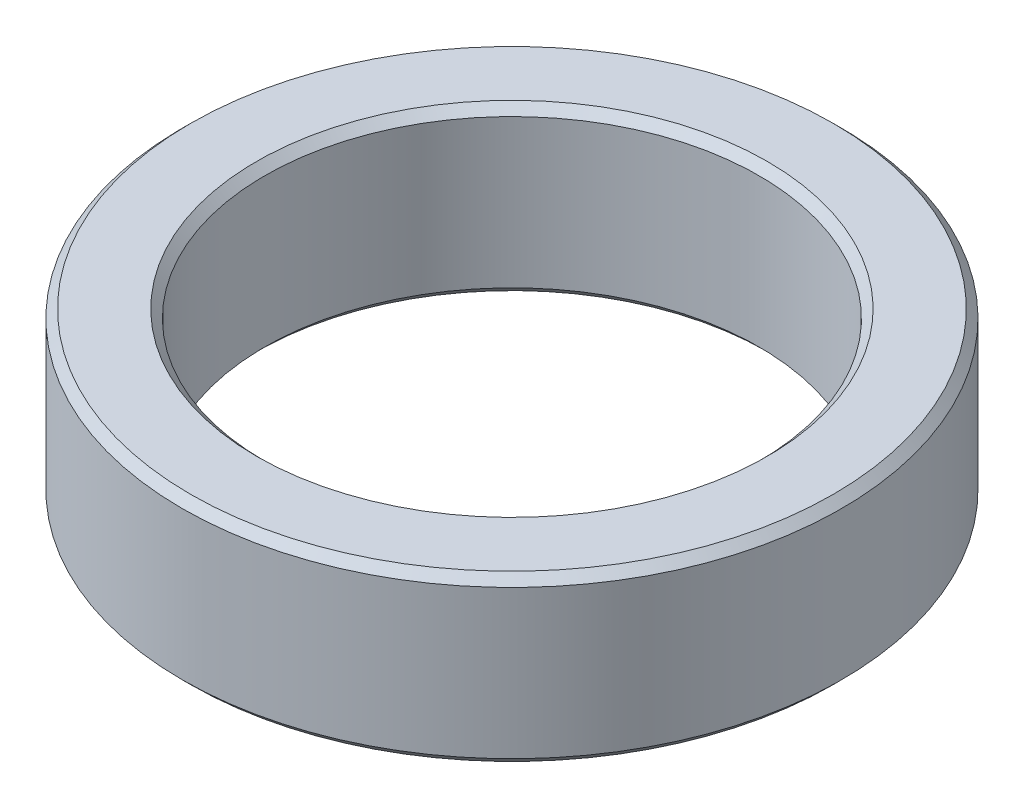
ISO-10303-21;
HEADER;
FILE_DESCRIPTION(('STEP AP214'),'2;1');
FILE_NAME('part.step','',(''),(''),'','','');
FILE_SCHEMA(('AUTOMOTIVE_DESIGN { 1 0 10303 214 1 1 1 1 }'));
ENDSEC;
DATA;
#1=APPLICATION_CONTEXT('core data for automotive mechanical design processes');
#2=APPLICATION_PROTOCOL_DEFINITION('international standard','automotive_design',2000,#1);
#3=PRODUCT_CONTEXT('',#1,'mechanical');
#4=PRODUCT('Part','Part','',(#3));
#5=PRODUCT_RELATED_PRODUCT_CATEGORY('part','',(#4));
#6=PRODUCT_DEFINITION_FORMATION('','',#4);
#7=PRODUCT_DEFINITION_CONTEXT('part definition',#1,'design');
#8=PRODUCT_DEFINITION('design','',#6,#7);
#9=PRODUCT_DEFINITION_SHAPE('','',#8);
#10=(LENGTH_UNIT() NAMED_UNIT(*) SI_UNIT(.MILLI.,.METRE.));
#11=(NAMED_UNIT(*) PLANE_ANGLE_UNIT() SI_UNIT($,.RADIAN.));
#12=(NAMED_UNIT(*) SI_UNIT($,.STERADIAN.) SOLID_ANGLE_UNIT());
#13=UNCERTAINTY_MEASURE_WITH_UNIT(LENGTH_MEASURE(1.E-05),#10,'distance_accuracy_value','');
#14=(GEOMETRIC_REPRESENTATION_CONTEXT(3) GLOBAL_UNCERTAINTY_ASSIGNED_CONTEXT((#13)) GLOBAL_UNIT_ASSIGNED_CONTEXT((#10,
#11,#12)) REPRESENTATION_CONTEXT('',''));
#15=CARTESIAN_POINT('',(0.,0.,0.));
#16=DIRECTION('',(0.,0.,1.));
#17=DIRECTION('',(1.,0.,0.));
#18=AXIS2_PLACEMENT_3D('',#15,#16,#17);
#19=CARTESIAN_POINT('',(0.,5.,0.));
#20=DIRECTION('',(0.,1.,0.));
#21=DIRECTION('',(0.,0.,1.));
#22=AXIS2_PLACEMENT_3D('',#19,#20,#21);
#23=PLANE('',#22);
#24=CARTESIAN_POINT('',(0.,5.,0.));
#25=DIRECTION('',(0.,1.,0.));
#26=DIRECTION('',(0.,0.,1.));
#27=AXIS2_PLACEMENT_3D('',#24,#25,#26);
#28=CIRCLE('',#27,19.5);
#29=CARTESIAN_POINT('',(0.,5.,19.5));
#30=VERTEX_POINT('',#29);
#31=EDGE_CURVE('E10',#30,#30,#28,.T.);
#32=ORIENTED_EDGE('',*,*,#31,.T.);
#33=EDGE_LOOP('',(#32));
#34=FACE_BOUND('',#33,.T.);
#35=CARTESIAN_POINT('',(0.,5.,0.));
#36=DIRECTION('',(0.,1.,0.));
#37=DIRECTION('',(0.,0.,1.));
#38=AXIS2_PLACEMENT_3D('',#35,#36,#37);
#39=CIRCLE('',#38,15.5);
#40=CARTESIAN_POINT('',(0.,5.,15.5));
#41=VERTEX_POINT('',#40);
#42=EDGE_CURVE('E42',#41,#41,#39,.F.);
#43=ORIENTED_EDGE('',*,*,#42,.T.);
#44=EDGE_LOOP('',(#43));
#45=FACE_BOUND('',#44,.T.);
#46=ADVANCED_FACE('F34',(#34,#45),#23,.T.);
#47=CARTESIAN_POINT('',(0.,-5.,0.));
#48=DIRECTION('',(0.,1.,0.));
#49=DIRECTION('',(0.,0.,1.));
#50=AXIS2_PLACEMENT_3D('',#47,#48,#49);
#51=PLANE('',#50);
#52=CARTESIAN_POINT('',(0.,-5.,0.));
#53=DIRECTION('',(0.,1.,0.));
#54=DIRECTION('',(0.,0.,1.));
#55=AXIS2_PLACEMENT_3D('',#52,#53,#54);
#56=CIRCLE('',#55,15.5);
#57=CARTESIAN_POINT('',(0.,-5.,15.5));
#58=VERTEX_POINT('',#57);
#59=EDGE_CURVE('E61',#58,#58,#56,.T.);
#60=ORIENTED_EDGE('',*,*,#59,.T.);
#61=EDGE_LOOP('',(#60));
#62=FACE_BOUND('',#61,.T.);
#63=CARTESIAN_POINT('',(0.,-5.,0.));
#64=DIRECTION('',(0.,1.,0.));
#65=DIRECTION('',(0.,0.,1.));
#66=AXIS2_PLACEMENT_3D('',#63,#64,#65);
#67=CIRCLE('',#66,19.5);
#68=CARTESIAN_POINT('',(0.,-5.,19.5));
#69=VERTEX_POINT('',#68);
#70=EDGE_CURVE('E64',#69,#69,#67,.F.);
#71=ORIENTED_EDGE('',*,*,#70,.T.);
#72=EDGE_LOOP('',(#71));
#73=FACE_BOUND('',#72,.T.);
#74=ADVANCED_FACE('F68',(#62,#73),#51,.F.);
#75=CARTESIAN_POINT('',(0.,5.,0.));
#76=DIRECTION('',(0.,-1.,0.));
#77=DIRECTION('',(0.,0.,-1.));
#78=AXIS2_PLACEMENT_3D('',#75,#76,#77);
#79=CYLINDRICAL_SURFACE('',#78,20.);
#80=CARTESIAN_POINT('',(0.,-4.5,0.));
#81=DIRECTION('',(0.,1.,0.));
#82=DIRECTION('',(0.,0.,1.));
#83=AXIS2_PLACEMENT_3D('',#80,#81,#82);
#84=CIRCLE('',#83,20.);
#85=CARTESIAN_POINT('',(0.,-4.5,20.));
#86=VERTEX_POINT('',#85);
#87=EDGE_CURVE('E46',#86,#86,#84,.T.);
#88=ORIENTED_EDGE('',*,*,#87,.T.);
#89=EDGE_LOOP('',(#88));
#90=FACE_BOUND('',#89,.T.);
#91=CARTESIAN_POINT('',(0.,4.5,0.));
#92=DIRECTION('',(0.,1.,0.));
#93=DIRECTION('',(0.,0.,1.));
#94=AXIS2_PLACEMENT_3D('',#91,#92,#93);
#95=CIRCLE('',#94,20.);
#96=CARTESIAN_POINT('',(0.,4.5,20.));
#97=VERTEX_POINT('',#96);
#98=EDGE_CURVE('E50',#97,#97,#95,.F.);
#99=ORIENTED_EDGE('',*,*,#98,.T.);
#100=EDGE_LOOP('',(#99));
#101=FACE_BOUND('',#100,.T.);
#102=ADVANCED_FACE('F78',(#90,#101),#79,.T.);
#103=CARTESIAN_POINT('',(0.,5.,0.));
#104=DIRECTION('',(0.,-1.,0.));
#105=DIRECTION('',(0.,0.,-1.));
#106=AXIS2_PLACEMENT_3D('',#103,#104,#105);
#107=CYLINDRICAL_SURFACE('',#106,15.);
#108=CARTESIAN_POINT('',(0.,-4.5,0.));
#109=DIRECTION('',(0.,1.,0.));
#110=DIRECTION('',(0.,0.,1.));
#111=AXIS2_PLACEMENT_3D('',#108,#109,#110);
#112=CIRCLE('',#111,15.);
#113=CARTESIAN_POINT('',(0.,-4.5,15.));
#114=VERTEX_POINT('',#113);
#115=EDGE_CURVE('E55',#114,#114,#112,.F.);
#116=ORIENTED_EDGE('',*,*,#115,.T.);
#117=EDGE_LOOP('',(#116));
#118=FACE_BOUND('',#117,.T.);
#119=CARTESIAN_POINT('',(0.,4.5,0.));
#120=DIRECTION('',(0.,1.,0.));
#121=DIRECTION('',(0.,0.,1.));
#122=AXIS2_PLACEMENT_3D('',#119,#120,#121);
#123=CIRCLE('',#122,15.);
#124=CARTESIAN_POINT('',(0.,4.5,15.));
#125=VERTEX_POINT('',#124);
#126=EDGE_CURVE('E58',#125,#125,#123,.T.);
#127=ORIENTED_EDGE('',*,*,#126,.T.);
#128=EDGE_LOOP('',(#127));
#129=FACE_BOUND('',#128,.T.);
#130=ADVANCED_FACE('F81',(#118,#129),#107,.F.);
#131=CARTESIAN_POINT('',(0.,-5.,0.));
#132=DIRECTION('',(0.,-1.,0.));
#133=DIRECTION('',(0.,0.,-1.));
#134=AXIS2_PLACEMENT_3D('',#131,#132,#133);
#135=CONICAL_SURFACE('',#134,15.5,0.78539816339744);
#136=ORIENTED_EDGE('',*,*,#115,.F.);
#137=EDGE_LOOP('',(#136));
#138=FACE_BOUND('',#137,.T.);
#139=ORIENTED_EDGE('',*,*,#59,.F.);
#140=EDGE_LOOP('',(#139));
#141=FACE_BOUND('',#140,.T.);
#142=ADVANCED_FACE('F74',(#138,#141),#135,.F.);
#143=CARTESIAN_POINT('',(0.,-4.5,0.));
#144=DIRECTION('',(0.,1.,0.));
#145=DIRECTION('',(0.,0.,1.));
#146=AXIS2_PLACEMENT_3D('',#143,#144,#145);
#147=CONICAL_SURFACE('',#146,20.,0.785398163397452);
#148=ORIENTED_EDGE('',*,*,#70,.F.);
#149=EDGE_LOOP('',(#148));
#150=FACE_BOUND('',#149,.T.);
#151=ORIENTED_EDGE('',*,*,#87,.F.);
#152=EDGE_LOOP('',(#151));
#153=FACE_BOUND('',#152,.T.);
#154=ADVANCED_FACE('F70',(#150,#153),#147,.T.);
#155=CARTESIAN_POINT('',(0.,5.,0.));
#156=DIRECTION('',(0.,-1.,0.));
#157=DIRECTION('',(0.,0.,-1.));
#158=AXIS2_PLACEMENT_3D('',#155,#156,#157);
#159=CONICAL_SURFACE('',#158,19.5,0.785398163397448);
#160=ORIENTED_EDGE('',*,*,#98,.F.);
#161=EDGE_LOOP('',(#160));
#162=FACE_BOUND('',#161,.T.);
#163=ORIENTED_EDGE('',*,*,#31,.F.);
#164=EDGE_LOOP('',(#163));
#165=FACE_BOUND('',#164,.T.);
#166=ADVANCED_FACE('F73',(#162,#165),#159,.T.);
#167=CARTESIAN_POINT('',(0.,4.5,0.));
#168=DIRECTION('',(0.,1.,0.));
#169=DIRECTION('',(0.,0.,1.));
#170=AXIS2_PLACEMENT_3D('',#167,#168,#169);
#171=CONICAL_SURFACE('',#170,15.,0.78539816339745);
#172=ORIENTED_EDGE('',*,*,#42,.F.);
#173=EDGE_LOOP('',(#172));
#174=FACE_BOUND('',#173,.T.);
#175=ORIENTED_EDGE('',*,*,#126,.F.);
#176=EDGE_LOOP('',(#175));
#177=FACE_BOUND('',#176,.T.);
#178=ADVANCED_FACE('F37',(#174,#177),#171,.F.);
#179=CLOSED_SHELL('',(#46,#74,#102,#130,#142,#154,#166,#178));
#180=MANIFOLD_SOLID_BREP('B2',#179);
#181=ADVANCED_BREP_SHAPE_REPRESENTATION('',(#18,#180),#14);
#182=SHAPE_DEFINITION_REPRESENTATION(#9,#181);
ENDSEC;
END-ISO-10303-21;
